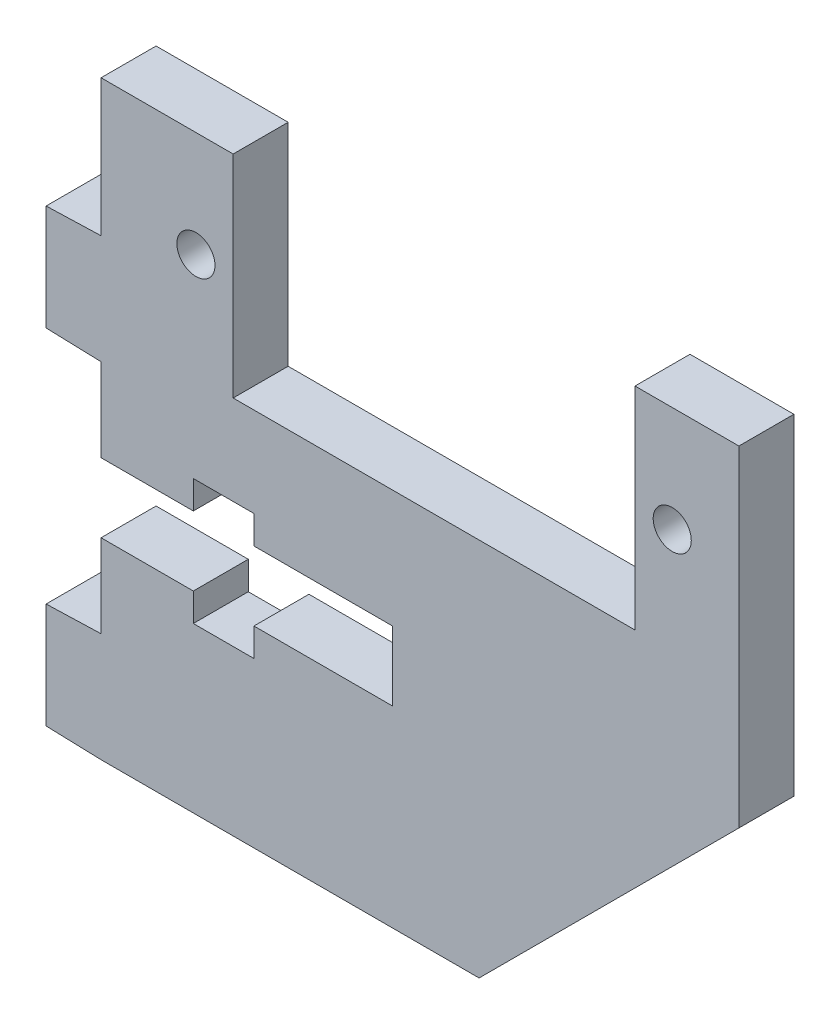
ISO-10303-21;
HEADER;
FILE_DESCRIPTION(('STEP AP214'),'2;1');
FILE_NAME('part.step','',(''),(''),'','','');
FILE_SCHEMA(('AUTOMOTIVE_DESIGN { 1 0 10303 214 1 1 1 1 }'));
ENDSEC;
DATA;
#1=APPLICATION_CONTEXT('core data for automotive mechanical design processes');
#2=APPLICATION_PROTOCOL_DEFINITION('international standard','automotive_design',2000,#1);
#3=PRODUCT_CONTEXT('',#1,'mechanical');
#4=PRODUCT('Part','Part','',(#3));
#5=PRODUCT_RELATED_PRODUCT_CATEGORY('part','',(#4));
#6=PRODUCT_DEFINITION_FORMATION('','',#4);
#7=PRODUCT_DEFINITION_CONTEXT('part definition',#1,'design');
#8=PRODUCT_DEFINITION('design','',#6,#7);
#9=PRODUCT_DEFINITION_SHAPE('','',#8);
#10=(LENGTH_UNIT() NAMED_UNIT(*) SI_UNIT(.MILLI.,.METRE.));
#11=(NAMED_UNIT(*) PLANE_ANGLE_UNIT() SI_UNIT($,.RADIAN.));
#12=(NAMED_UNIT(*) SI_UNIT($,.STERADIAN.) SOLID_ANGLE_UNIT());
#13=UNCERTAINTY_MEASURE_WITH_UNIT(LENGTH_MEASURE(1.E-05),#10,'distance_accuracy_value','');
#14=(GEOMETRIC_REPRESENTATION_CONTEXT(3) GLOBAL_UNCERTAINTY_ASSIGNED_CONTEXT((#13)) GLOBAL_UNIT_ASSIGNED_CONTEXT((#10,
#11,#12)) REPRESENTATION_CONTEXT('',''));
#15=CARTESIAN_POINT('',(0.,0.,0.));
#16=DIRECTION('',(0.,0.,1.));
#17=DIRECTION('',(1.,0.,0.));
#18=AXIS2_PLACEMENT_3D('',#15,#16,#17);
#19=CARTESIAN_POINT('',(0.626150510994199,19.8802787240632,3.175));
#20=DIRECTION('',(0.0314804525268916,0.999504367728677,0.));
#21=DIRECTION('',(-0.999504367728677,0.0314804525268916,0.));
#22=AXIS2_PLACEMENT_3D('',#19,#20,#21);
#23=PLANE('',#22);
#24=DIRECTION('',(0.999504367728677,-0.0314804525268917,0.));
#25=VECTOR('',#24,1.);
#26=CARTESIAN_POINT('',(0.626150510994199,19.8802787240632,0.));
#27=LINE('',#26,#25);
#28=CARTESIAN_POINT('',(0.,19.9,0.));
#29=VERTEX_POINT('',#28);
#30=CARTESIAN_POINT('',(3.175,19.8,0.));
#31=VERTEX_POINT('',#30);
#32=EDGE_CURVE('E244',#29,#31,#27,.T.);
#33=ORIENTED_EDGE('',*,*,#32,.T.);
#34=DIRECTION('',(0.,0.,-1.));
#35=VECTOR('',#34,1.);
#36=CARTESIAN_POINT('',(3.175,19.8,3.175));
#37=LINE('',#36,#35);
#38=CARTESIAN_POINT('',(3.175,19.8,3.175));
#39=VERTEX_POINT('',#38);
#40=EDGE_CURVE('E224',#39,#31,#37,.T.);
#41=ORIENTED_EDGE('',*,*,#40,.F.);
#42=DIRECTION('',(0.999504367728677,-0.0314804525268917,0.));
#43=VECTOR('',#42,1.);
#44=CARTESIAN_POINT('',(0.626150510994199,19.8802787240632,3.175));
#45=LINE('',#44,#43);
#46=CARTESIAN_POINT('',(0.,19.9,3.175));
#47=VERTEX_POINT('',#46);
#48=EDGE_CURVE('E231',#47,#39,#45,.T.);
#49=ORIENTED_EDGE('',*,*,#48,.F.);
#50=DIRECTION('',(0.,0.,-1.));
#51=VECTOR('',#50,1.);
#52=CARTESIAN_POINT('',(0.,19.9,3.175));
#53=LINE('',#52,#51);
#54=EDGE_CURVE('E302',#47,#29,#53,.T.);
#55=ORIENTED_EDGE('',*,*,#54,.T.);
#56=EDGE_LOOP('',(#33,#41,#49,#55));
#57=FACE_BOUND('',#56,.T.);
#58=ADVANCED_FACE('F35',(#57),#23,.F.);
#59=CARTESIAN_POINT('',(3.175,0.,3.175));
#60=DIRECTION('',(1.,0.,0.));
#61=DIRECTION('',(0.,1.,0.));
#62=AXIS2_PLACEMENT_3D('',#59,#60,#61);
#63=PLANE('',#62);
#64=DIRECTION('',(0.,-1.,0.));
#65=VECTOR('',#64,1.);
#66=CARTESIAN_POINT('',(3.175,0.,0.));
#67=LINE('',#66,#65);
#68=CARTESIAN_POINT('',(3.175,15.,0.));
#69=VERTEX_POINT('',#68);
#70=EDGE_CURVE('E380',#31,#69,#67,.T.);
#71=ORIENTED_EDGE('',*,*,#70,.T.);
#72=DIRECTION('',(0.,0.,-1.));
#73=VECTOR('',#72,1.);
#74=CARTESIAN_POINT('',(3.175,15.,3.175));
#75=LINE('',#74,#73);
#76=CARTESIAN_POINT('',(3.175,15.,3.175));
#77=VERTEX_POINT('',#76);
#78=EDGE_CURVE('E227',#77,#69,#75,.T.);
#79=ORIENTED_EDGE('',*,*,#78,.F.);
#80=DIRECTION('',(0.,-1.,0.));
#81=VECTOR('',#80,1.);
#82=CARTESIAN_POINT('',(3.175,0.,3.175));
#83=LINE('',#82,#81);
#84=EDGE_CURVE('E220',#39,#77,#83,.T.);
#85=ORIENTED_EDGE('',*,*,#84,.F.);
#86=ORIENTED_EDGE('',*,*,#40,.T.);
#87=EDGE_LOOP('',(#71,#79,#85,#86));
#88=FACE_BOUND('',#87,.T.);
#89=ADVANCED_FACE('F222',(#88),#63,.F.);
#90=CARTESIAN_POINT('',(0.,15.,3.175));
#91=DIRECTION('',(0.,1.,0.));
#92=DIRECTION('',(0.,0.,1.));
#93=AXIS2_PLACEMENT_3D('',#90,#91,#92);
#94=PLANE('',#93);
#95=DIRECTION('',(1.,0.,0.));
#96=VECTOR('',#95,1.);
#97=CARTESIAN_POINT('',(0.,15.,0.));
#98=LINE('',#97,#96);
#99=CARTESIAN_POINT('',(8.5,15.,0.));
#100=VERTEX_POINT('',#99);
#101=EDGE_CURVE('E377',#69,#100,#98,.T.);
#102=ORIENTED_EDGE('',*,*,#101,.T.);
#103=DIRECTION('',(0.,0.,-1.));
#104=VECTOR('',#103,1.);
#105=CARTESIAN_POINT('',(8.5,15.,3.175));
#106=LINE('',#105,#104);
#107=CARTESIAN_POINT('',(8.5,15.,3.175));
#108=VERTEX_POINT('',#107);
#109=EDGE_CURVE('E249',#108,#100,#106,.T.);
#110=ORIENTED_EDGE('',*,*,#109,.F.);
#111=DIRECTION('',(1.,0.,0.));
#112=VECTOR('',#111,1.);
#113=CARTESIAN_POINT('',(0.,15.,3.175));
#114=LINE('',#113,#112);
#115=EDGE_CURVE('E230',#77,#108,#114,.T.);
#116=ORIENTED_EDGE('',*,*,#115,.F.);
#117=ORIENTED_EDGE('',*,*,#78,.T.);
#118=EDGE_LOOP('',(#102,#110,#116,#117));
#119=FACE_BOUND('',#118,.T.);
#120=ADVANCED_FACE('F453',(#119),#94,.F.);
#121=CARTESIAN_POINT('',(8.5,0.,3.175));
#122=DIRECTION('',(1.,0.,0.));
#123=DIRECTION('',(0.,0.,-1.));
#124=AXIS2_PLACEMENT_3D('',#121,#122,#123);
#125=PLANE('',#124);
#126=DIRECTION('',(0.,-1.,0.));
#127=VECTOR('',#126,1.);
#128=CARTESIAN_POINT('',(8.5,0.,0.));
#129=LINE('',#128,#127);
#130=CARTESIAN_POINT('',(8.5,16.625,0.));
#131=VERTEX_POINT('',#130);
#132=EDGE_CURVE('E374',#131,#100,#129,.T.);
#133=ORIENTED_EDGE('',*,*,#132,.F.);
#134=DIRECTION('',(0.,0.,-1.));
#135=VECTOR('',#134,1.);
#136=CARTESIAN_POINT('',(8.5,16.625,3.175));
#137=LINE('',#136,#135);
#138=CARTESIAN_POINT('',(8.5,16.625,3.175));
#139=VERTEX_POINT('',#138);
#140=EDGE_CURVE('E254',#139,#131,#137,.T.);
#141=ORIENTED_EDGE('',*,*,#140,.F.);
#142=DIRECTION('',(0.,-1.,0.));
#143=VECTOR('',#142,1.);
#144=CARTESIAN_POINT('',(8.5,0.,3.175));
#145=LINE('',#144,#143);
#146=EDGE_CURVE('E447',#139,#108,#145,.T.);
#147=ORIENTED_EDGE('',*,*,#146,.T.);
#148=ORIENTED_EDGE('',*,*,#109,.T.);
#149=EDGE_LOOP('',(#133,#141,#147,#148));
#150=FACE_BOUND('',#149,.T.);
#151=ADVANCED_FACE('F457',(#150),#125,.T.);
#152=CARTESIAN_POINT('',(0.,16.625,3.175));
#153=DIRECTION('',(0.,1.,0.));
#154=DIRECTION('',(0.,0.,1.));
#155=AXIS2_PLACEMENT_3D('',#152,#153,#154);
#156=PLANE('',#155);
#157=DIRECTION('',(1.,0.,0.));
#158=VECTOR('',#157,1.);
#159=CARTESIAN_POINT('',(0.,16.625,0.));
#160=LINE('',#159,#158);
#161=CARTESIAN_POINT('',(12.,16.625,0.));
#162=VERTEX_POINT('',#161);
#163=EDGE_CURVE('E372',#131,#162,#160,.T.);
#164=ORIENTED_EDGE('',*,*,#163,.T.);
#165=DIRECTION('',(0.,0.,-1.));
#166=VECTOR('',#165,1.);
#167=CARTESIAN_POINT('',(12.,16.625,3.175));
#168=LINE('',#167,#166);
#169=CARTESIAN_POINT('',(12.,16.625,3.175));
#170=VERTEX_POINT('',#169);
#171=EDGE_CURVE('E256',#170,#162,#168,.T.);
#172=ORIENTED_EDGE('',*,*,#171,.F.);
#173=DIRECTION('',(1.,0.,0.));
#174=VECTOR('',#173,1.);
#175=CARTESIAN_POINT('',(0.,16.625,3.175));
#176=LINE('',#175,#174);
#177=EDGE_CURVE('E445',#139,#170,#176,.T.);
#178=ORIENTED_EDGE('',*,*,#177,.F.);
#179=ORIENTED_EDGE('',*,*,#140,.T.);
#180=EDGE_LOOP('',(#164,#172,#178,#179));
#181=FACE_BOUND('',#180,.T.);
#182=ADVANCED_FACE('F462',(#181),#156,.F.);
#183=CARTESIAN_POINT('',(12.,0.,3.175));
#184=DIRECTION('',(1.,0.,0.));
#185=DIRECTION('',(0.,0.,-1.));
#186=AXIS2_PLACEMENT_3D('',#183,#184,#185);
#187=PLANE('',#186);
#188=DIRECTION('',(0.,-1.,0.));
#189=VECTOR('',#188,1.);
#190=CARTESIAN_POINT('',(12.,0.,0.));
#191=LINE('',#190,#189);
#192=CARTESIAN_POINT('',(12.,15.,0.));
#193=VERTEX_POINT('',#192);
#194=EDGE_CURVE('E370',#162,#193,#191,.T.);
#195=ORIENTED_EDGE('',*,*,#194,.T.);
#196=DIRECTION('',(0.,0.,-1.));
#197=VECTOR('',#196,1.);
#198=CARTESIAN_POINT('',(12.,15.,3.175));
#199=LINE('',#198,#197);
#200=CARTESIAN_POINT('',(12.,15.,3.175));
#201=VERTEX_POINT('',#200);
#202=EDGE_CURVE('E259',#201,#193,#199,.T.);
#203=ORIENTED_EDGE('',*,*,#202,.F.);
#204=DIRECTION('',(0.,-1.,0.));
#205=VECTOR('',#204,1.);
#206=CARTESIAN_POINT('',(12.,0.,3.175));
#207=LINE('',#206,#205);
#208=EDGE_CURVE('E443',#170,#201,#207,.T.);
#209=ORIENTED_EDGE('',*,*,#208,.F.);
#210=ORIENTED_EDGE('',*,*,#171,.T.);
#211=EDGE_LOOP('',(#195,#203,#209,#210));
#212=FACE_BOUND('',#211,.T.);
#213=ADVANCED_FACE('F468',(#212),#187,.F.);
#214=CARTESIAN_POINT('',(0.,15.,3.175));
#215=DIRECTION('',(0.,1.,0.));
#216=DIRECTION('',(0.,0.,1.));
#217=AXIS2_PLACEMENT_3D('',#214,#215,#216);
#218=PLANE('',#217);
#219=DIRECTION('',(1.,0.,0.));
#220=VECTOR('',#219,1.);
#221=CARTESIAN_POINT('',(0.,15.,0.));
#222=LINE('',#221,#220);
#223=CARTESIAN_POINT('',(20.,15.,0.));
#224=VERTEX_POINT('',#223);
#225=EDGE_CURVE('E368',#193,#224,#222,.T.);
#226=ORIENTED_EDGE('',*,*,#225,.T.);
#227=DIRECTION('',(0.,0.,-1.));
#228=VECTOR('',#227,1.);
#229=CARTESIAN_POINT('',(20.,15.,3.175));
#230=LINE('',#229,#228);
#231=CARTESIAN_POINT('',(20.,15.,3.175));
#232=VERTEX_POINT('',#231);
#233=EDGE_CURVE('E262',#232,#224,#230,.T.);
#234=ORIENTED_EDGE('',*,*,#233,.F.);
#235=DIRECTION('',(1.,0.,0.));
#236=VECTOR('',#235,1.);
#237=CARTESIAN_POINT('',(0.,15.,3.175));
#238=LINE('',#237,#236);
#239=EDGE_CURVE('E441',#201,#232,#238,.T.);
#240=ORIENTED_EDGE('',*,*,#239,.F.);
#241=ORIENTED_EDGE('',*,*,#202,.T.);
#242=EDGE_LOOP('',(#226,#234,#240,#241));
#243=FACE_BOUND('',#242,.T.);
#244=ADVANCED_FACE('F472',(#243),#218,.F.);
#245=CARTESIAN_POINT('',(20.,0.,3.175));
#246=DIRECTION('',(1.,0.,0.));
#247=DIRECTION('',(0.,0.,-1.));
#248=AXIS2_PLACEMENT_3D('',#245,#246,#247);
#249=PLANE('',#248);
#250=DIRECTION('',(0.,-1.,0.));
#251=VECTOR('',#250,1.);
#252=CARTESIAN_POINT('',(20.,0.,0.));
#253=LINE('',#252,#251);
#254=CARTESIAN_POINT('',(20.,11.,0.));
#255=VERTEX_POINT('',#254);
#256=EDGE_CURVE('E365',#224,#255,#253,.T.);
#257=ORIENTED_EDGE('',*,*,#256,.T.);
#258=DIRECTION('',(0.,0.,-1.));
#259=VECTOR('',#258,1.);
#260=CARTESIAN_POINT('',(20.,11.,3.175));
#261=LINE('',#260,#259);
#262=CARTESIAN_POINT('',(20.,11.,3.175));
#263=VERTEX_POINT('',#262);
#264=EDGE_CURVE('E265',#263,#255,#261,.T.);
#265=ORIENTED_EDGE('',*,*,#264,.F.);
#266=DIRECTION('',(0.,-1.,0.));
#267=VECTOR('',#266,1.);
#268=CARTESIAN_POINT('',(20.,0.,3.175));
#269=LINE('',#268,#267);
#270=EDGE_CURVE('E439',#232,#263,#269,.T.);
#271=ORIENTED_EDGE('',*,*,#270,.F.);
#272=ORIENTED_EDGE('',*,*,#233,.T.);
#273=EDGE_LOOP('',(#257,#265,#271,#272));
#274=FACE_BOUND('',#273,.T.);
#275=ADVANCED_FACE('F477',(#274),#249,.F.);
#276=CARTESIAN_POINT('',(0.,11.,3.175));
#277=DIRECTION('',(0.,1.,0.));
#278=DIRECTION('',(0.,0.,1.));
#279=AXIS2_PLACEMENT_3D('',#276,#277,#278);
#280=PLANE('',#279);
#281=DIRECTION('',(1.,0.,0.));
#282=VECTOR('',#281,1.);
#283=CARTESIAN_POINT('',(0.,11.,0.));
#284=LINE('',#283,#282);
#285=CARTESIAN_POINT('',(12.,11.,0.));
#286=VERTEX_POINT('',#285);
#287=EDGE_CURVE('E362',#286,#255,#284,.T.);
#288=ORIENTED_EDGE('',*,*,#287,.F.);
#289=DIRECTION('',(0.,0.,-1.));
#290=VECTOR('',#289,1.);
#291=CARTESIAN_POINT('',(12.,11.,3.175));
#292=LINE('',#291,#290);
#293=CARTESIAN_POINT('',(12.,11.,3.175));
#294=VERTEX_POINT('',#293);
#295=EDGE_CURVE('E267',#294,#286,#292,.T.);
#296=ORIENTED_EDGE('',*,*,#295,.F.);
#297=DIRECTION('',(1.,0.,0.));
#298=VECTOR('',#297,1.);
#299=CARTESIAN_POINT('',(0.,11.,3.175));
#300=LINE('',#299,#298);
#301=EDGE_CURVE('E436',#294,#263,#300,.T.);
#302=ORIENTED_EDGE('',*,*,#301,.T.);
#303=ORIENTED_EDGE('',*,*,#264,.T.);
#304=EDGE_LOOP('',(#288,#296,#302,#303));
#305=FACE_BOUND('',#304,.T.);
#306=ADVANCED_FACE('F484',(#305),#280,.T.);
#307=CARTESIAN_POINT('',(12.,0.,3.175));
#308=DIRECTION('',(1.,0.,0.));
#309=DIRECTION('',(0.,0.,-1.));
#310=AXIS2_PLACEMENT_3D('',#307,#308,#309);
#311=PLANE('',#310);
#312=DIRECTION('',(0.,-1.,0.));
#313=VECTOR('',#312,1.);
#314=CARTESIAN_POINT('',(12.,0.,0.));
#315=LINE('',#314,#313);
#316=CARTESIAN_POINT('',(12.,9.375,0.));
#317=VERTEX_POINT('',#316);
#318=EDGE_CURVE('E359',#286,#317,#315,.T.);
#319=ORIENTED_EDGE('',*,*,#318,.T.);
#320=DIRECTION('',(0.,0.,-1.));
#321=VECTOR('',#320,1.);
#322=CARTESIAN_POINT('',(12.,9.375,3.175));
#323=LINE('',#322,#321);
#324=CARTESIAN_POINT('',(12.,9.375,3.175));
#325=VERTEX_POINT('',#324);
#326=EDGE_CURVE('E269',#325,#317,#323,.T.);
#327=ORIENTED_EDGE('',*,*,#326,.F.);
#328=DIRECTION('',(0.,-1.,0.));
#329=VECTOR('',#328,1.);
#330=CARTESIAN_POINT('',(12.,0.,3.175));
#331=LINE('',#330,#329);
#332=EDGE_CURVE('E434',#294,#325,#331,.T.);
#333=ORIENTED_EDGE('',*,*,#332,.F.);
#334=ORIENTED_EDGE('',*,*,#295,.T.);
#335=EDGE_LOOP('',(#319,#327,#333,#334));
#336=FACE_BOUND('',#335,.T.);
#337=ADVANCED_FACE('F487',(#336),#311,.F.);
#338=CARTESIAN_POINT('',(0.,9.375,3.175));
#339=DIRECTION('',(0.,1.,0.));
#340=DIRECTION('',(0.,0.,1.));
#341=AXIS2_PLACEMENT_3D('',#338,#339,#340);
#342=PLANE('',#341);
#343=DIRECTION('',(1.,0.,0.));
#344=VECTOR('',#343,1.);
#345=CARTESIAN_POINT('',(0.,9.375,0.));
#346=LINE('',#345,#344);
#347=CARTESIAN_POINT('',(8.5,9.375,0.));
#348=VERTEX_POINT('',#347);
#349=EDGE_CURVE('E356',#348,#317,#346,.T.);
#350=ORIENTED_EDGE('',*,*,#349,.F.);
#351=DIRECTION('',(0.,0.,-1.));
#352=VECTOR('',#351,1.);
#353=CARTESIAN_POINT('',(8.5,9.375,3.175));
#354=LINE('',#353,#352);
#355=CARTESIAN_POINT('',(8.5,9.375,3.175));
#356=VERTEX_POINT('',#355);
#357=EDGE_CURVE('E271',#356,#348,#354,.T.);
#358=ORIENTED_EDGE('',*,*,#357,.F.);
#359=DIRECTION('',(1.,0.,0.));
#360=VECTOR('',#359,1.);
#361=CARTESIAN_POINT('',(0.,9.375,3.175));
#362=LINE('',#361,#360);
#363=EDGE_CURVE('E431',#356,#325,#362,.T.);
#364=ORIENTED_EDGE('',*,*,#363,.T.);
#365=ORIENTED_EDGE('',*,*,#326,.T.);
#366=EDGE_LOOP('',(#350,#358,#364,#365));
#367=FACE_BOUND('',#366,.T.);
#368=ADVANCED_FACE('F490',(#367),#342,.T.);
#369=CARTESIAN_POINT('',(8.5,0.,3.175));
#370=DIRECTION('',(1.,0.,0.));
#371=DIRECTION('',(0.,0.,-1.));
#372=AXIS2_PLACEMENT_3D('',#369,#370,#371);
#373=PLANE('',#372);
#374=DIRECTION('',(0.,-1.,0.));
#375=VECTOR('',#374,1.);
#376=CARTESIAN_POINT('',(8.5,0.,0.));
#377=LINE('',#376,#375);
#378=CARTESIAN_POINT('',(8.5,11.,0.));
#379=VERTEX_POINT('',#378);
#380=EDGE_CURVE('E353',#379,#348,#377,.T.);
#381=ORIENTED_EDGE('',*,*,#380,.F.);
#382=DIRECTION('',(0.,0.,-1.));
#383=VECTOR('',#382,1.);
#384=CARTESIAN_POINT('',(8.5,11.,3.175));
#385=LINE('',#384,#383);
#386=CARTESIAN_POINT('',(8.5,11.,3.175));
#387=VERTEX_POINT('',#386);
#388=EDGE_CURVE('E273',#387,#379,#385,.T.);
#389=ORIENTED_EDGE('',*,*,#388,.F.);
#390=DIRECTION('',(0.,-1.,0.));
#391=VECTOR('',#390,1.);
#392=CARTESIAN_POINT('',(8.5,0.,3.175));
#393=LINE('',#392,#391);
#394=EDGE_CURVE('E428',#387,#356,#393,.T.);
#395=ORIENTED_EDGE('',*,*,#394,.T.);
#396=ORIENTED_EDGE('',*,*,#357,.T.);
#397=EDGE_LOOP('',(#381,#389,#395,#396));
#398=FACE_BOUND('',#397,.T.);
#399=ADVANCED_FACE('F495',(#398),#373,.T.);
#400=CARTESIAN_POINT('',(0.,11.,3.175));
#401=DIRECTION('',(0.,1.,0.));
#402=DIRECTION('',(0.,0.,1.));
#403=AXIS2_PLACEMENT_3D('',#400,#401,#402);
#404=PLANE('',#403);
#405=DIRECTION('',(1.,0.,0.));
#406=VECTOR('',#405,1.);
#407=CARTESIAN_POINT('',(0.,11.,0.));
#408=LINE('',#407,#406);
#409=CARTESIAN_POINT('',(3.175,11.,0.));
#410=VERTEX_POINT('',#409);
#411=EDGE_CURVE('E350',#410,#379,#408,.T.);
#412=ORIENTED_EDGE('',*,*,#411,.F.);
#413=DIRECTION('',(0.,0.,-1.));
#414=VECTOR('',#413,1.);
#415=CARTESIAN_POINT('',(3.175,11.,3.175));
#416=LINE('',#415,#414);
#417=CARTESIAN_POINT('',(3.175,11.,3.175));
#418=VERTEX_POINT('',#417);
#419=EDGE_CURVE('E275',#418,#410,#416,.T.);
#420=ORIENTED_EDGE('',*,*,#419,.F.);
#421=DIRECTION('',(1.,0.,0.));
#422=VECTOR('',#421,1.);
#423=CARTESIAN_POINT('',(0.,11.,3.175));
#424=LINE('',#423,#422);
#425=EDGE_CURVE('E425',#418,#387,#424,.T.);
#426=ORIENTED_EDGE('',*,*,#425,.T.);
#427=ORIENTED_EDGE('',*,*,#388,.T.);
#428=EDGE_LOOP('',(#412,#420,#426,#427));
#429=FACE_BOUND('',#428,.T.);
#430=ADVANCED_FACE('F498',(#429),#404,.T.);
#431=CARTESIAN_POINT('',(3.175,0.,3.175));
#432=DIRECTION('',(1.,0.,0.));
#433=DIRECTION('',(0.,1.,0.));
#434=AXIS2_PLACEMENT_3D('',#431,#432,#433);
#435=PLANE('',#434);
#436=DIRECTION('',(0.,-1.,0.));
#437=VECTOR('',#436,1.);
#438=CARTESIAN_POINT('',(3.175,0.,0.));
#439=LINE('',#438,#437);
#440=CARTESIAN_POINT('',(3.175,6.2,0.));
#441=VERTEX_POINT('',#440);
#442=EDGE_CURVE('E347',#410,#441,#439,.T.);
#443=ORIENTED_EDGE('',*,*,#442,.T.);
#444=DIRECTION('',(0.,0.,-1.));
#445=VECTOR('',#444,1.);
#446=CARTESIAN_POINT('',(3.175,6.2,3.175));
#447=LINE('',#446,#445);
#448=CARTESIAN_POINT('',(3.175,6.2,3.175));
#449=VERTEX_POINT('',#448);
#450=EDGE_CURVE('E277',#449,#441,#447,.T.);
#451=ORIENTED_EDGE('',*,*,#450,.F.);
#452=DIRECTION('',(0.,-1.,0.));
#453=VECTOR('',#452,1.);
#454=CARTESIAN_POINT('',(3.175,0.,3.175));
#455=LINE('',#454,#453);
#456=EDGE_CURVE('E423',#418,#449,#455,.T.);
#457=ORIENTED_EDGE('',*,*,#456,.F.);
#458=ORIENTED_EDGE('',*,*,#419,.T.);
#459=EDGE_LOOP('',(#443,#451,#457,#458));
#460=FACE_BOUND('',#459,.T.);
#461=ADVANCED_FACE('F504',(#460),#435,.F.);
#462=CARTESIAN_POINT('',(-0.191935583772066,6.09395478476308,3.175));
#463=DIRECTION('',(-0.0314804525268876,0.999504367728677,0.));
#464=DIRECTION('',(-0.999504367728677,-0.0314804525268876,0.));
#465=AXIS2_PLACEMENT_3D('',#462,#463,#464);
#466=PLANE('',#465);
#467=DIRECTION('',(0.999504367728677,0.0314804525268876,0.));
#468=VECTOR('',#467,1.);
#469=CARTESIAN_POINT('',(-0.191935583772066,6.09395478476308,0.));
#470=LINE('',#469,#468);
#471=CARTESIAN_POINT('',(0.,6.1,0.));
#472=VERTEX_POINT('',#471);
#473=EDGE_CURVE('E344',#472,#441,#470,.T.);
#474=ORIENTED_EDGE('',*,*,#473,.F.);
#475=DIRECTION('',(0.,0.,-1.));
#476=VECTOR('',#475,1.);
#477=CARTESIAN_POINT('',(0.,6.1,3.175));
#478=LINE('',#477,#476);
#479=CARTESIAN_POINT('',(0.,6.1,3.175));
#480=VERTEX_POINT('',#479);
#481=EDGE_CURVE('E279',#480,#472,#478,.T.);
#482=ORIENTED_EDGE('',*,*,#481,.F.);
#483=DIRECTION('',(0.999504367728677,0.0314804525268876,0.));
#484=VECTOR('',#483,1.);
#485=CARTESIAN_POINT('',(-0.191935583772066,6.09395478476308,3.175));
#486=LINE('',#485,#484);
#487=EDGE_CURVE('E420',#480,#449,#486,.T.);
#488=ORIENTED_EDGE('',*,*,#487,.T.);
#489=ORIENTED_EDGE('',*,*,#450,.T.);
#490=EDGE_LOOP('',(#474,#482,#488,#489));
#491=FACE_BOUND('',#490,.T.);
#492=ADVANCED_FACE('F508',(#491),#466,.T.);
#493=CARTESIAN_POINT('',(0.,0.,3.175));
#494=DIRECTION('',(-1.,0.,0.));
#495=DIRECTION('',(0.,-1.,0.));
#496=AXIS2_PLACEMENT_3D('',#493,#494,#495);
#497=PLANE('',#496);
#498=DIRECTION('',(0.,1.,0.));
#499=VECTOR('',#498,1.);
#500=CARTESIAN_POINT('',(0.,0.,0.));
#501=LINE('',#500,#499);
#502=CARTESIAN_POINT('',(0.,0.,0.));
#503=VERTEX_POINT('',#502);
#504=EDGE_CURVE('E341',#503,#472,#501,.T.);
#505=ORIENTED_EDGE('',*,*,#504,.F.);
#506=DIRECTION('',(0.,0.,-1.));
#507=VECTOR('',#506,1.);
#508=CARTESIAN_POINT('',(0.,0.,3.175));
#509=LINE('',#508,#507);
#510=CARTESIAN_POINT('',(0.,0.,3.175));
#511=VERTEX_POINT('',#510);
#512=EDGE_CURVE('E281',#511,#503,#509,.T.);
#513=ORIENTED_EDGE('',*,*,#512,.F.);
#514=DIRECTION('',(0.,1.,0.));
#515=VECTOR('',#514,1.);
#516=CARTESIAN_POINT('',(0.,0.,3.175));
#517=LINE('',#516,#515);
#518=EDGE_CURVE('E417',#511,#480,#517,.T.);
#519=ORIENTED_EDGE('',*,*,#518,.T.);
#520=ORIENTED_EDGE('',*,*,#481,.T.);
#521=EDGE_LOOP('',(#505,#513,#519,#520));
#522=FACE_BOUND('',#521,.T.);
#523=ADVANCED_FACE('F511',(#522),#497,.T.);
#524=CARTESIAN_POINT('',(0.,0.,3.175));
#525=DIRECTION('',(-0.0314804525268875,-0.999504367728677,0.));
#526=DIRECTION('',(0.999504367728677,-0.0314804525268875,0.));
#527=AXIS2_PLACEMENT_3D('',#524,#525,#526);
#528=PLANE('',#527);
#529=DIRECTION('',(-0.999504367728677,0.0314804525268875,0.));
#530=VECTOR('',#529,1.);
#531=CARTESIAN_POINT('',(0.,0.,0.));
#532=LINE('',#531,#530);
#533=CARTESIAN_POINT('',(3.175,-0.1,0.));
#534=VERTEX_POINT('',#533);
#535=EDGE_CURVE('E338',#534,#503,#532,.T.);
#536=ORIENTED_EDGE('',*,*,#535,.F.);
#537=DIRECTION('',(0.,0.,-1.));
#538=VECTOR('',#537,1.);
#539=CARTESIAN_POINT('',(3.175,-0.1,3.175));
#540=LINE('',#539,#538);
#541=CARTESIAN_POINT('',(3.175,-0.1,3.175));
#542=VERTEX_POINT('',#541);
#543=EDGE_CURVE('E283',#542,#534,#540,.T.);
#544=ORIENTED_EDGE('',*,*,#543,.F.);
#545=DIRECTION('',(-0.999504367728677,0.0314804525268875,0.));
#546=VECTOR('',#545,1.);
#547=CARTESIAN_POINT('',(0.,0.,3.175));
#548=LINE('',#547,#546);
#549=EDGE_CURVE('E414',#542,#511,#548,.T.);
#550=ORIENTED_EDGE('',*,*,#549,.T.);
#551=ORIENTED_EDGE('',*,*,#512,.T.);
#552=EDGE_LOOP('',(#536,#544,#550,#551));
#553=FACE_BOUND('',#552,.T.);
#554=ADVANCED_FACE('F515',(#553),#528,.T.);
#555=CARTESIAN_POINT('',(0.,-0.1,3.175));
#556=DIRECTION('',(0.,1.,0.));
#557=DIRECTION('',(0.,0.,1.));
#558=AXIS2_PLACEMENT_3D('',#555,#556,#557);
#559=PLANE('',#558);
#560=DIRECTION('',(1.,0.,0.));
#561=VECTOR('',#560,1.);
#562=CARTESIAN_POINT('',(0.,-0.1,0.));
#563=LINE('',#562,#561);
#564=CARTESIAN_POINT('',(24.9999999999999,-0.1,0.));
#565=VERTEX_POINT('',#564);
#566=EDGE_CURVE('E336',#534,#565,#563,.T.);
#567=ORIENTED_EDGE('',*,*,#566,.T.);
#568=DIRECTION('',(0.,0.,1.));
#569=VECTOR('',#568,1.);
#570=CARTESIAN_POINT('',(24.9999999999999,-0.1,3.175));
#571=LINE('',#570,#569);
#572=CARTESIAN_POINT('',(24.9999999999999,-0.100000000000001,3.175));
#573=VERTEX_POINT('',#572);
#574=EDGE_CURVE('E43',#565,#573,#571,.T.);
#575=ORIENTED_EDGE('',*,*,#574,.T.);
#576=DIRECTION('',(1.,0.,0.));
#577=VECTOR('',#576,1.);
#578=CARTESIAN_POINT('',(0.,-0.1,3.175));
#579=LINE('',#578,#577);
#580=EDGE_CURVE('E412',#542,#573,#579,.T.);
#581=ORIENTED_EDGE('',*,*,#580,.F.);
#582=ORIENTED_EDGE('',*,*,#543,.T.);
#583=EDGE_LOOP('',(#567,#575,#581,#582));
#584=FACE_BOUND('',#583,.T.);
#585=ADVANCED_FACE('F516',(#584),#559,.F.);
#586=CARTESIAN_POINT('',(40.,0.,3.175));
#587=DIRECTION('',(-1.,0.,0.));
#588=DIRECTION('',(0.,0.,1.));
#589=AXIS2_PLACEMENT_3D('',#586,#587,#588);
#590=PLANE('',#589);
#591=DIRECTION('',(0.,1.,0.));
#592=VECTOR('',#591,1.);
#593=CARTESIAN_POINT('',(40.,0.,3.175));
#594=LINE('',#593,#592);
#595=CARTESIAN_POINT('',(40.,14.9,3.175));
#596=VERTEX_POINT('',#595);
#597=CARTESIAN_POINT('',(40.,34.,3.175));
#598=VERTEX_POINT('',#597);
#599=EDGE_CURVE('E410',#596,#598,#594,.T.);
#600=ORIENTED_EDGE('',*,*,#599,.F.);
#601=DIRECTION('',(0.,0.,-1.));
#602=VECTOR('',#601,1.);
#603=CARTESIAN_POINT('',(40.,14.9,3.175));
#604=LINE('',#603,#602);
#605=CARTESIAN_POINT('',(40.,14.9,0.));
#606=VERTEX_POINT('',#605);
#607=EDGE_CURVE('E245',#596,#606,#604,.T.);
#608=ORIENTED_EDGE('',*,*,#607,.T.);
#609=DIRECTION('',(0.,1.,0.));
#610=VECTOR('',#609,1.);
#611=CARTESIAN_POINT('',(40.,0.,0.));
#612=LINE('',#611,#610);
#613=CARTESIAN_POINT('',(40.,34.,0.));
#614=VERTEX_POINT('',#613);
#615=EDGE_CURVE('E334',#606,#614,#612,.T.);
#616=ORIENTED_EDGE('',*,*,#615,.T.);
#617=DIRECTION('',(0.,0.,-1.));
#618=VECTOR('',#617,1.);
#619=CARTESIAN_POINT('',(40.,34.,3.175));
#620=LINE('',#619,#618);
#621=EDGE_CURVE('E285',#598,#614,#620,.T.);
#622=ORIENTED_EDGE('',*,*,#621,.F.);
#623=EDGE_LOOP('',(#600,#608,#616,#622));
#624=FACE_BOUND('',#623,.T.);
#625=ADVANCED_FACE('F522',(#624),#590,.F.);
#626=CARTESIAN_POINT('',(0.,34.,3.175));
#627=DIRECTION('',(0.,1.,0.));
#628=DIRECTION('',(-1.,0.,0.));
#629=AXIS2_PLACEMENT_3D('',#626,#627,#628);
#630=PLANE('',#629);
#631=DIRECTION('',(1.,0.,0.));
#632=VECTOR('',#631,1.);
#633=CARTESIAN_POINT('',(0.,34.,0.));
#634=LINE('',#633,#632);
#635=CARTESIAN_POINT('',(34.,34.,0.));
#636=VERTEX_POINT('',#635);
#637=EDGE_CURVE('E331',#636,#614,#634,.T.);
#638=ORIENTED_EDGE('',*,*,#637,.F.);
#639=DIRECTION('',(0.,0.,-1.));
#640=VECTOR('',#639,1.);
#641=CARTESIAN_POINT('',(34.,34.,3.175));
#642=LINE('',#641,#640);
#643=CARTESIAN_POINT('',(34.,34.,3.175));
#644=VERTEX_POINT('',#643);
#645=EDGE_CURVE('E288',#644,#636,#642,.T.);
#646=ORIENTED_EDGE('',*,*,#645,.F.);
#647=DIRECTION('',(1.,0.,0.));
#648=VECTOR('',#647,1.);
#649=CARTESIAN_POINT('',(0.,34.,3.175));
#650=LINE('',#649,#648);
#651=EDGE_CURVE('E407',#644,#598,#650,.T.);
#652=ORIENTED_EDGE('',*,*,#651,.T.);
#653=ORIENTED_EDGE('',*,*,#621,.T.);
#654=EDGE_LOOP('',(#638,#646,#652,#653));
#655=FACE_BOUND('',#654,.T.);
#656=ADVANCED_FACE('F529',(#655),#630,.T.);
#657=CARTESIAN_POINT('',(34.,0.,3.175));
#658=DIRECTION('',(-1.,0.,0.));
#659=DIRECTION('',(0.,0.,1.));
#660=AXIS2_PLACEMENT_3D('',#657,#658,#659);
#661=PLANE('',#660);
#662=DIRECTION('',(0.,1.,0.));
#663=VECTOR('',#662,1.);
#664=CARTESIAN_POINT('',(34.,0.,0.));
#665=LINE('',#664,#663);
#666=CARTESIAN_POINT('',(34.,21.8,0.));
#667=VERTEX_POINT('',#666);
#668=EDGE_CURVE('E328',#667,#636,#665,.T.);
#669=ORIENTED_EDGE('',*,*,#668,.F.);
#670=DIRECTION('',(0.,0.,-1.));
#671=VECTOR('',#670,1.);
#672=CARTESIAN_POINT('',(34.,21.8,3.175));
#673=LINE('',#672,#671);
#674=CARTESIAN_POINT('',(34.,21.8,3.175));
#675=VERTEX_POINT('',#674);
#676=EDGE_CURVE('E290',#675,#667,#673,.T.);
#677=ORIENTED_EDGE('',*,*,#676,.F.);
#678=DIRECTION('',(0.,1.,0.));
#679=VECTOR('',#678,1.);
#680=CARTESIAN_POINT('',(34.,0.,3.175));
#681=LINE('',#680,#679);
#682=EDGE_CURVE('E404',#675,#644,#681,.T.);
#683=ORIENTED_EDGE('',*,*,#682,.T.);
#684=ORIENTED_EDGE('',*,*,#645,.T.);
#685=EDGE_LOOP('',(#669,#677,#683,#684));
#686=FACE_BOUND('',#685,.T.);
#687=ADVANCED_FACE('F534',(#686),#661,.T.);
#688=CARTESIAN_POINT('',(0.,21.8,3.175));
#689=DIRECTION('',(0.,1.,0.));
#690=DIRECTION('',(0.,0.,1.));
#691=AXIS2_PLACEMENT_3D('',#688,#689,#690);
#692=PLANE('',#691);
#693=DIRECTION('',(1.,0.,0.));
#694=VECTOR('',#693,1.);
#695=CARTESIAN_POINT('',(0.,21.8,0.));
#696=LINE('',#695,#694);
#697=CARTESIAN_POINT('',(10.8,21.8,0.));
#698=VERTEX_POINT('',#697);
#699=EDGE_CURVE('E325',#698,#667,#696,.T.);
#700=ORIENTED_EDGE('',*,*,#699,.F.);
#701=DIRECTION('',(0.,0.,-1.));
#702=VECTOR('',#701,1.);
#703=CARTESIAN_POINT('',(10.8,21.8,3.175));
#704=LINE('',#703,#702);
#705=CARTESIAN_POINT('',(10.8,21.8,3.175));
#706=VERTEX_POINT('',#705);
#707=EDGE_CURVE('E292',#706,#698,#704,.T.);
#708=ORIENTED_EDGE('',*,*,#707,.F.);
#709=DIRECTION('',(1.,0.,0.));
#710=VECTOR('',#709,1.);
#711=CARTESIAN_POINT('',(0.,21.8,3.175));
#712=LINE('',#711,#710);
#713=EDGE_CURVE('E401',#706,#675,#712,.T.);
#714=ORIENTED_EDGE('',*,*,#713,.T.);
#715=ORIENTED_EDGE('',*,*,#676,.T.);
#716=EDGE_LOOP('',(#700,#708,#714,#715));
#717=FACE_BOUND('',#716,.T.);
#718=ADVANCED_FACE('F537',(#717),#692,.T.);
#719=CARTESIAN_POINT('',(10.8,0.,3.175));
#720=DIRECTION('',(1.,0.,0.));
#721=DIRECTION('',(0.,0.,-1.));
#722=AXIS2_PLACEMENT_3D('',#719,#720,#721);
#723=PLANE('',#722);
#724=DIRECTION('',(0.,-1.,0.));
#725=VECTOR('',#724,1.);
#726=CARTESIAN_POINT('',(10.8,0.,0.));
#727=LINE('',#726,#725);
#728=CARTESIAN_POINT('',(10.8,34.,0.));
#729=VERTEX_POINT('',#728);
#730=EDGE_CURVE('E322',#729,#698,#727,.T.);
#731=ORIENTED_EDGE('',*,*,#730,.F.);
#732=DIRECTION('',(0.,0.,-1.));
#733=VECTOR('',#732,1.);
#734=CARTESIAN_POINT('',(10.8,34.,3.175));
#735=LINE('',#734,#733);
#736=CARTESIAN_POINT('',(10.8,34.,3.175));
#737=VERTEX_POINT('',#736);
#738=EDGE_CURVE('E294',#737,#729,#735,.T.);
#739=ORIENTED_EDGE('',*,*,#738,.F.);
#740=DIRECTION('',(0.,-1.,0.));
#741=VECTOR('',#740,1.);
#742=CARTESIAN_POINT('',(10.8,0.,3.175));
#743=LINE('',#742,#741);
#744=EDGE_CURVE('E398',#737,#706,#743,.T.);
#745=ORIENTED_EDGE('',*,*,#744,.T.);
#746=ORIENTED_EDGE('',*,*,#707,.T.);
#747=EDGE_LOOP('',(#731,#739,#745,#746));
#748=FACE_BOUND('',#747,.T.);
#749=ADVANCED_FACE('F542',(#748),#723,.T.);
#750=CARTESIAN_POINT('',(0.,34.,3.175));
#751=DIRECTION('',(0.,1.,0.));
#752=DIRECTION('',(0.,0.,1.));
#753=AXIS2_PLACEMENT_3D('',#750,#751,#752);
#754=PLANE('',#753);
#755=DIRECTION('',(1.,0.,0.));
#756=VECTOR('',#755,1.);
#757=CARTESIAN_POINT('',(0.,34.,0.));
#758=LINE('',#757,#756);
#759=CARTESIAN_POINT('',(3.175,34.,0.));
#760=VERTEX_POINT('',#759);
#761=EDGE_CURVE('E319',#760,#729,#758,.T.);
#762=ORIENTED_EDGE('',*,*,#761,.F.);
#763=DIRECTION('',(0.,0.,-1.));
#764=VECTOR('',#763,1.);
#765=CARTESIAN_POINT('',(3.175,34.,3.175));
#766=LINE('',#765,#764);
#767=CARTESIAN_POINT('',(3.175,34.,3.175));
#768=VERTEX_POINT('',#767);
#769=EDGE_CURVE('E296',#768,#760,#766,.T.);
#770=ORIENTED_EDGE('',*,*,#769,.F.);
#771=DIRECTION('',(1.,0.,0.));
#772=VECTOR('',#771,1.);
#773=CARTESIAN_POINT('',(0.,34.,3.175));
#774=LINE('',#773,#772);
#775=EDGE_CURVE('E395',#768,#737,#774,.T.);
#776=ORIENTED_EDGE('',*,*,#775,.T.);
#777=ORIENTED_EDGE('',*,*,#738,.T.);
#778=EDGE_LOOP('',(#762,#770,#776,#777));
#779=FACE_BOUND('',#778,.T.);
#780=ADVANCED_FACE('F545',(#779),#754,.T.);
#781=CARTESIAN_POINT('',(3.175,0.,3.175));
#782=DIRECTION('',(-1.,0.,0.));
#783=DIRECTION('',(0.,0.,1.));
#784=AXIS2_PLACEMENT_3D('',#781,#782,#783);
#785=PLANE('',#784);
#786=DIRECTION('',(0.,1.,0.));
#787=VECTOR('',#786,1.);
#788=CARTESIAN_POINT('',(3.175,0.,0.));
#789=LINE('',#788,#787);
#790=CARTESIAN_POINT('',(3.175,26.1,0.));
#791=VERTEX_POINT('',#790);
#792=EDGE_CURVE('E316',#791,#760,#789,.T.);
#793=ORIENTED_EDGE('',*,*,#792,.F.);
#794=DIRECTION('',(0.,0.,-1.));
#795=VECTOR('',#794,1.);
#796=CARTESIAN_POINT('',(3.175,26.1,3.175));
#797=LINE('',#796,#795);
#798=CARTESIAN_POINT('',(3.175,26.1,3.175));
#799=VERTEX_POINT('',#798);
#800=EDGE_CURVE('E298',#799,#791,#797,.T.);
#801=ORIENTED_EDGE('',*,*,#800,.F.);
#802=DIRECTION('',(0.,1.,0.));
#803=VECTOR('',#802,1.);
#804=CARTESIAN_POINT('',(3.175,0.,3.175));
#805=LINE('',#804,#803);
#806=EDGE_CURVE('E392',#799,#768,#805,.T.);
#807=ORIENTED_EDGE('',*,*,#806,.T.);
#808=ORIENTED_EDGE('',*,*,#769,.T.);
#809=EDGE_LOOP('',(#793,#801,#807,#808));
#810=FACE_BOUND('',#809,.T.);
#811=ADVANCED_FACE('F549',(#810),#785,.T.);
#812=CARTESIAN_POINT('',(-0.818086094766176,25.9742335088262,3.175));
#813=DIRECTION('',(-0.0314804525268873,0.999504367728677,0.));
#814=DIRECTION('',(-0.999504367728677,-0.0314804525268873,0.));
#815=AXIS2_PLACEMENT_3D('',#812,#813,#814);
#816=PLANE('',#815);
#817=DIRECTION('',(0.999504367728677,0.0314804525268873,0.));
#818=VECTOR('',#817,1.);
#819=CARTESIAN_POINT('',(-0.818086094766176,25.9742335088262,0.));
#820=LINE('',#819,#818);
#821=CARTESIAN_POINT('',(0.,26.,0.));
#822=VERTEX_POINT('',#821);
#823=EDGE_CURVE('E313',#822,#791,#820,.T.);
#824=ORIENTED_EDGE('',*,*,#823,.F.);
#825=DIRECTION('',(0.,0.,-1.));
#826=VECTOR('',#825,1.);
#827=CARTESIAN_POINT('',(0.,26.,3.175));
#828=LINE('',#827,#826);
#829=CARTESIAN_POINT('',(0.,26.,3.175));
#830=VERTEX_POINT('',#829);
#831=EDGE_CURVE('E300',#830,#822,#828,.T.);
#832=ORIENTED_EDGE('',*,*,#831,.F.);
#833=DIRECTION('',(0.999504367728677,0.0314804525268873,0.));
#834=VECTOR('',#833,1.);
#835=CARTESIAN_POINT('',(-0.818086094766176,25.9742335088262,3.175));
#836=LINE('',#835,#834);
#837=EDGE_CURVE('E389',#830,#799,#836,.T.);
#838=ORIENTED_EDGE('',*,*,#837,.T.);
#839=ORIENTED_EDGE('',*,*,#800,.T.);
#840=EDGE_LOOP('',(#824,#832,#838,#839));
#841=FACE_BOUND('',#840,.T.);
#842=ADVANCED_FACE('F552',(#841),#816,.T.);
#843=CARTESIAN_POINT('',(8.65,27.9,3.175));
#844=DIRECTION('',(0.,0.,-1.));
#845=DIRECTION('',(-1.,0.,0.));
#846=AXIS2_PLACEMENT_3D('',#843,#844,#845);
#847=CYLINDRICAL_SURFACE('',#846,1.1);
#848=CARTESIAN_POINT('',(8.65,27.9,3.175));
#849=DIRECTION('',(0.,0.,1.));
#850=DIRECTION('',(1.,0.,0.));
#851=AXIS2_PLACEMENT_3D('',#848,#849,#850);
#852=CIRCLE('',#851,1.1);
#853=CARTESIAN_POINT('',(9.75,27.9,3.175));
#854=VERTEX_POINT('',#853);
#855=EDGE_CURVE('E385',#854,#854,#852,.T.);
#856=ORIENTED_EDGE('',*,*,#855,.T.);
#857=EDGE_LOOP('',(#856));
#858=FACE_BOUND('',#857,.T.);
#859=CARTESIAN_POINT('',(8.65,27.9,0.));
#860=DIRECTION('',(0.,0.,1.));
#861=DIRECTION('',(1.,0.,0.));
#862=AXIS2_PLACEMENT_3D('',#859,#860,#861);
#863=CIRCLE('',#862,1.1);
#864=CARTESIAN_POINT('',(9.75,27.9,0.));
#865=VERTEX_POINT('',#864);
#866=EDGE_CURVE('E307',#865,#865,#863,.T.);
#867=ORIENTED_EDGE('',*,*,#866,.F.);
#868=EDGE_LOOP('',(#867));
#869=FACE_BOUND('',#868,.T.);
#870=ADVANCED_FACE('F558',(#858,#869),#847,.F.);
#871=CARTESIAN_POINT('',(0.,0.,3.175));
#872=DIRECTION('',(-1.,0.,0.));
#873=DIRECTION('',(0.,-1.,0.));
#874=AXIS2_PLACEMENT_3D('',#871,#872,#873);
#875=PLANE('',#874);
#876=DIRECTION('',(0.,1.,0.));
#877=VECTOR('',#876,1.);
#878=CARTESIAN_POINT('',(0.,0.,0.));
#879=LINE('',#878,#877);
#880=EDGE_CURVE('E310',#29,#822,#879,.T.);
#881=ORIENTED_EDGE('',*,*,#880,.F.);
#882=ORIENTED_EDGE('',*,*,#54,.F.);
#883=DIRECTION('',(0.,1.,0.));
#884=VECTOR('',#883,1.);
#885=CARTESIAN_POINT('',(0.,0.,3.175));
#886=LINE('',#885,#884);
#887=EDGE_CURVE('E239',#47,#830,#886,.T.);
#888=ORIENTED_EDGE('',*,*,#887,.T.);
#889=ORIENTED_EDGE('',*,*,#831,.T.);
#890=EDGE_LOOP('',(#881,#882,#888,#889));
#891=FACE_BOUND('',#890,.T.);
#892=ADVANCED_FACE('F555',(#891),#875,.T.);
#893=CARTESIAN_POINT('',(36.15,27.9,3.175));
#894=DIRECTION('',(0.,0.,-1.));
#895=DIRECTION('',(-1.,0.,0.));
#896=AXIS2_PLACEMENT_3D('',#893,#894,#895);
#897=CYLINDRICAL_SURFACE('',#896,1.10000000000001);
#898=CARTESIAN_POINT('',(36.15,27.9,3.175));
#899=DIRECTION('',(0.,0.,1.));
#900=DIRECTION('',(1.,0.,0.));
#901=AXIS2_PLACEMENT_3D('',#898,#899,#900);
#902=CIRCLE('',#901,1.10000000000001);
#903=CARTESIAN_POINT('',(37.25,27.9,3.175));
#904=VERTEX_POINT('',#903);
#905=EDGE_CURVE('E304',#904,#904,#902,.T.);
#906=ORIENTED_EDGE('',*,*,#905,.T.);
#907=EDGE_LOOP('',(#906));
#908=FACE_BOUND('',#907,.T.);
#909=CARTESIAN_POINT('',(36.15,27.9,0.));
#910=DIRECTION('',(0.,0.,1.));
#911=DIRECTION('',(1.,0.,0.));
#912=AXIS2_PLACEMENT_3D('',#909,#910,#911);
#913=CIRCLE('',#912,1.10000000000001);
#914=CARTESIAN_POINT('',(37.25,27.9,0.));
#915=VERTEX_POINT('',#914);
#916=EDGE_CURVE('E241',#915,#915,#913,.T.);
#917=ORIENTED_EDGE('',*,*,#916,.F.);
#918=EDGE_LOOP('',(#917));
#919=FACE_BOUND('',#918,.T.);
#920=ADVANCED_FACE('F557',(#908,#919),#897,.F.);
#921=CARTESIAN_POINT('',(0.,0.,3.175));
#922=DIRECTION('',(0.,0.,1.));
#923=DIRECTION('',(1.,0.,0.));
#924=AXIS2_PLACEMENT_3D('',#921,#922,#923);
#925=PLANE('',#924);
#926=ORIENTED_EDGE('',*,*,#580,.T.);
#927=DIRECTION('',(-0.707106781186549,-0.707106781186546,0.));
#928=VECTOR('',#927,1.);
#929=CARTESIAN_POINT('',(12.5499999999999,-12.55,3.175));
#930=LINE('',#929,#928);
#931=EDGE_CURVE('E11',#573,#596,#930,.F.);
#932=ORIENTED_EDGE('',*,*,#931,.T.);
#933=ORIENTED_EDGE('',*,*,#599,.T.);
#934=ORIENTED_EDGE('',*,*,#651,.F.);
#935=ORIENTED_EDGE('',*,*,#682,.F.);
#936=ORIENTED_EDGE('',*,*,#713,.F.);
#937=ORIENTED_EDGE('',*,*,#744,.F.);
#938=ORIENTED_EDGE('',*,*,#775,.F.);
#939=ORIENTED_EDGE('',*,*,#806,.F.);
#940=ORIENTED_EDGE('',*,*,#837,.F.);
#941=ORIENTED_EDGE('',*,*,#887,.F.);
#942=ORIENTED_EDGE('',*,*,#48,.T.);
#943=ORIENTED_EDGE('',*,*,#84,.T.);
#944=ORIENTED_EDGE('',*,*,#115,.T.);
#945=ORIENTED_EDGE('',*,*,#146,.F.);
#946=ORIENTED_EDGE('',*,*,#177,.T.);
#947=ORIENTED_EDGE('',*,*,#208,.T.);
#948=ORIENTED_EDGE('',*,*,#239,.T.);
#949=ORIENTED_EDGE('',*,*,#270,.T.);
#950=ORIENTED_EDGE('',*,*,#301,.F.);
#951=ORIENTED_EDGE('',*,*,#332,.T.);
#952=ORIENTED_EDGE('',*,*,#363,.F.);
#953=ORIENTED_EDGE('',*,*,#394,.F.);
#954=ORIENTED_EDGE('',*,*,#425,.F.);
#955=ORIENTED_EDGE('',*,*,#456,.T.);
#956=ORIENTED_EDGE('',*,*,#487,.F.);
#957=ORIENTED_EDGE('',*,*,#518,.F.);
#958=ORIENTED_EDGE('',*,*,#549,.F.);
#959=EDGE_LOOP('',(#926,#932,#933,#934,#935,#936,#937,#938,#939,#940,#941,#942,#943,#944,#945,
#946,#947,#948,#949,#950,#951,#952,#953,#954,#955,#956,#957,#958));
#960=FACE_BOUND('',#959,.T.);
#961=ORIENTED_EDGE('',*,*,#855,.F.);
#962=EDGE_LOOP('',(#961));
#963=FACE_BOUND('',#962,.T.);
#964=ORIENTED_EDGE('',*,*,#905,.F.);
#965=EDGE_LOOP('',(#964));
#966=FACE_BOUND('',#965,.T.);
#967=ADVANCED_FACE('F235',(#960,#963,#966),#925,.T.);
#968=CARTESIAN_POINT('',(0.,0.,0.));
#969=DIRECTION('',(0.,0.,1.));
#970=DIRECTION('',(1.,0.,0.));
#971=AXIS2_PLACEMENT_3D('',#968,#969,#970);
#972=PLANE('',#971);
#973=ORIENTED_EDGE('',*,*,#615,.F.);
#974=DIRECTION('',(0.707106781186549,0.707106781186546,0.));
#975=VECTOR('',#974,1.);
#976=CARTESIAN_POINT('',(40.,14.9,0.));
#977=LINE('',#976,#975);
#978=EDGE_CURVE('E57',#606,#565,#977,.F.);
#979=ORIENTED_EDGE('',*,*,#978,.T.);
#980=ORIENTED_EDGE('',*,*,#566,.F.);
#981=ORIENTED_EDGE('',*,*,#535,.T.);
#982=ORIENTED_EDGE('',*,*,#504,.T.);
#983=ORIENTED_EDGE('',*,*,#473,.T.);
#984=ORIENTED_EDGE('',*,*,#442,.F.);
#985=ORIENTED_EDGE('',*,*,#411,.T.);
#986=ORIENTED_EDGE('',*,*,#380,.T.);
#987=ORIENTED_EDGE('',*,*,#349,.T.);
#988=ORIENTED_EDGE('',*,*,#318,.F.);
#989=ORIENTED_EDGE('',*,*,#287,.T.);
#990=ORIENTED_EDGE('',*,*,#256,.F.);
#991=ORIENTED_EDGE('',*,*,#225,.F.);
#992=ORIENTED_EDGE('',*,*,#194,.F.);
#993=ORIENTED_EDGE('',*,*,#163,.F.);
#994=ORIENTED_EDGE('',*,*,#132,.T.);
#995=ORIENTED_EDGE('',*,*,#101,.F.);
#996=ORIENTED_EDGE('',*,*,#70,.F.);
#997=ORIENTED_EDGE('',*,*,#32,.F.);
#998=ORIENTED_EDGE('',*,*,#880,.T.);
#999=ORIENTED_EDGE('',*,*,#823,.T.);
#1000=ORIENTED_EDGE('',*,*,#792,.T.);
#1001=ORIENTED_EDGE('',*,*,#761,.T.);
#1002=ORIENTED_EDGE('',*,*,#730,.T.);
#1003=ORIENTED_EDGE('',*,*,#699,.T.);
#1004=ORIENTED_EDGE('',*,*,#668,.T.);
#1005=ORIENTED_EDGE('',*,*,#637,.T.);
#1006=EDGE_LOOP('',(#973,#979,#980,#981,#982,#983,#984,#985,#986,#987,#988,#989,#990,#991,#992,
#993,#994,#995,#996,#997,#998,#999,#1000,#1001,#1002,#1003,#1004,#1005));
#1007=FACE_BOUND('',#1006,.T.);
#1008=ORIENTED_EDGE('',*,*,#866,.T.);
#1009=EDGE_LOOP('',(#1008));
#1010=FACE_BOUND('',#1009,.T.);
#1011=ORIENTED_EDGE('',*,*,#916,.T.);
#1012=EDGE_LOOP('',(#1011));
#1013=FACE_BOUND('',#1012,.T.);
#1014=ADVANCED_FACE('F524',(#1007,#1010,#1013),#972,.F.);
#1015=CARTESIAN_POINT('',(40.,14.9,3.175));
#1016=DIRECTION('',(-0.707106781186546,0.707106781186549,0.));
#1017=DIRECTION('',(0.,0.,-1.));
#1018=AXIS2_PLACEMENT_3D('',#1015,#1016,#1017);
#1019=PLANE('',#1018);
#1020=ORIENTED_EDGE('',*,*,#931,.F.);
#1021=ORIENTED_EDGE('',*,*,#574,.F.);
#1022=ORIENTED_EDGE('',*,*,#978,.F.);
#1023=ORIENTED_EDGE('',*,*,#607,.F.);
#1024=EDGE_LOOP('',(#1020,#1021,#1022,#1023));
#1025=FACE_BOUND('',#1024,.T.);
#1026=ADVANCED_FACE('F37',(#1025),#1019,.F.);
#1027=CLOSED_SHELL('',(#58,#89,#120,#151,#182,#213,#244,#275,#306,#337,#368,#399,#430,#461,#492,
#523,#554,#585,#625,#656,#687,#718,#749,#780,#811,#842,#870,#892,#920,#967,#1014,#1026));
#1028=MANIFOLD_SOLID_BREP('B2',#1027);
#1029=ADVANCED_BREP_SHAPE_REPRESENTATION('',(#18,#1028),#14);
#1030=SHAPE_DEFINITION_REPRESENTATION(#9,#1029);
ENDSEC;
END-ISO-10303-21;
